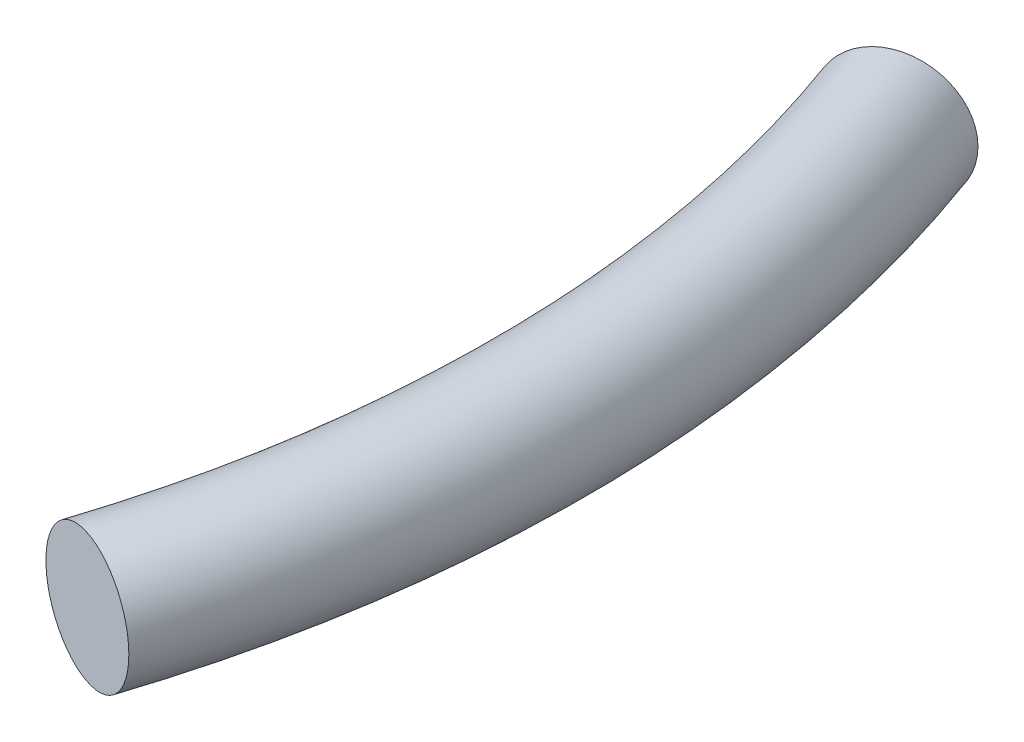
ISO-10303-21;
HEADER;
FILE_DESCRIPTION(('STEP AP214'),'2;1');
FILE_NAME('part.step','',(''),(''),'','','');
FILE_SCHEMA(('AUTOMOTIVE_DESIGN { 1 0 10303 214 1 1 1 1 }'));
ENDSEC;
DATA;
#1=APPLICATION_CONTEXT('core data for automotive mechanical design processes');
#2=APPLICATION_PROTOCOL_DEFINITION('international standard','automotive_design',2000,#1);
#3=PRODUCT_CONTEXT('',#1,'mechanical');
#4=PRODUCT('Part','Part','',(#3));
#5=PRODUCT_RELATED_PRODUCT_CATEGORY('part','',(#4));
#6=PRODUCT_DEFINITION_FORMATION('','',#4);
#7=PRODUCT_DEFINITION_CONTEXT('part definition',#1,'design');
#8=PRODUCT_DEFINITION('design','',#6,#7);
#9=PRODUCT_DEFINITION_SHAPE('','',#8);
#10=(LENGTH_UNIT() NAMED_UNIT(*) SI_UNIT(.MILLI.,.METRE.));
#11=(NAMED_UNIT(*) PLANE_ANGLE_UNIT() SI_UNIT($,.RADIAN.));
#12=(NAMED_UNIT(*) SI_UNIT($,.STERADIAN.) SOLID_ANGLE_UNIT());
#13=UNCERTAINTY_MEASURE_WITH_UNIT(LENGTH_MEASURE(1.E-05),#10,'distance_accuracy_value','');
#14=(GEOMETRIC_REPRESENTATION_CONTEXT(3) GLOBAL_UNCERTAINTY_ASSIGNED_CONTEXT((#13)) GLOBAL_UNIT_ASSIGNED_CONTEXT((#10,
#11,#12)) REPRESENTATION_CONTEXT('',''));
#15=CARTESIAN_POINT('',(0.,0.,0.));
#16=DIRECTION('',(0.,0.,1.));
#17=DIRECTION('',(1.,0.,0.));
#18=AXIS2_PLACEMENT_3D('',#15,#16,#17);
#19=CARTESIAN_POINT('',(0.,5.,0.));
#20=DIRECTION('',(-0.342020143325676,0.,-0.939692620785906));
#21=DIRECTION('',(-0.939692620785906,0.,0.342020143325676));
#22=AXIS2_PLACEMENT_3D('',#19,#20,#21);
#23=PLANE('',#22);
#24=CARTESIAN_POINT('',(7.35309475764971,0.7302,-2.67630762152341));
#25=DIRECTION('',(0.342020143325676,0.,0.939692620785906));
#26=DIRECTION('',(-0.939692620785906,0.,0.342020143325676));
#27=AXIS2_PLACEMENT_3D('',#24,#25,#26);
#28=CIRCLE('',#27,0.4);
#29=CARTESIAN_POINT('',(7.72897180596407,0.7302,-2.81311567885369));
#30=VERTEX_POINT('',#29);
#31=EDGE_CURVE('E18',#30,#30,#28,.T.);
#32=ORIENTED_EDGE('',*,*,#31,.F.);
#33=EDGE_LOOP('',(#32));
#34=FACE_BOUND('',#33,.T.);
#35=ADVANCED_FACE('F15',(#34),#23,.T.);
#36=CARTESIAN_POINT('',(0.,5.,0.));
#37=DIRECTION('',(0.309016994374942,0.,-0.951056516295155));
#38=DIRECTION('',(-0.951056516295155,0.,-0.309016994374942));
#39=AXIS2_PLACEMENT_3D('',#36,#37,#38);
#40=PLANE('',#39);
#41=CARTESIAN_POINT('',(7.44201724000959,0.7302,2.41805798098392));
#42=DIRECTION('',(-0.309016994374942,0.,0.951056516295155));
#43=DIRECTION('',(-0.951056516295156,0.,-0.309016994374942));
#44=AXIS2_PLACEMENT_3D('',#41,#42,#43);
#45=CIRCLE('',#44,0.4);
#46=CARTESIAN_POINT('',(7.82243984652765,0.7302,2.5416647787339));
#47=VERTEX_POINT('',#46);
#48=EDGE_CURVE('E10',#47,#47,#45,.T.);
#49=ORIENTED_EDGE('',*,*,#48,.T.);
#50=EDGE_LOOP('',(#49));
#51=FACE_BOUND('',#50,.T.);
#52=ADVANCED_FACE('F36',(#51),#40,.F.);
#53=CARTESIAN_POINT('',(0.,0.7302,0.));
#54=DIRECTION('',(0.,-1.,0.));
#55=DIRECTION('',(-0.342020143325676,0.,-0.939692620785906));
#56=AXIS2_PLACEMENT_3D('',#53,#54,#55);
#57=TOROIDAL_SURFACE('',#56,7.825,0.4);
#58=CARTESIAN_POINT('',(0.,0.7302,0.));
#59=DIRECTION('',(0.,-1.,0.));
#60=DIRECTION('',(-0.342020143325676,0.,-0.939692620785906));
#61=AXIS2_PLACEMENT_3D('',#58,#59,#60);
#62=CIRCLE('',#61,8.225);
#63=EDGE_CURVE('',#30,#47,#62,.T.);
#64=ORIENTED_EDGE('',*,*,#31,.T.);
#65=ORIENTED_EDGE('',*,*,#48,.F.);
#66=ORIENTED_EDGE('',*,*,#63,.T.);
#67=ORIENTED_EDGE('',*,*,#63,.F.);
#68=EDGE_LOOP('',(#64,#66,#65,#67));
#69=FACE_BOUND('',#68,.T.);
#70=ADVANCED_FACE('F33',(#69),#57,.T.);
#71=CLOSED_SHELL('',(#35,#52,#70));
#72=MANIFOLD_SOLID_BREP('B1',#71);
#73=ADVANCED_BREP_SHAPE_REPRESENTATION('',(#18,#72),#14);
#74=SHAPE_DEFINITION_REPRESENTATION(#9,#73);
ENDSEC;
END-ISO-10303-21;
